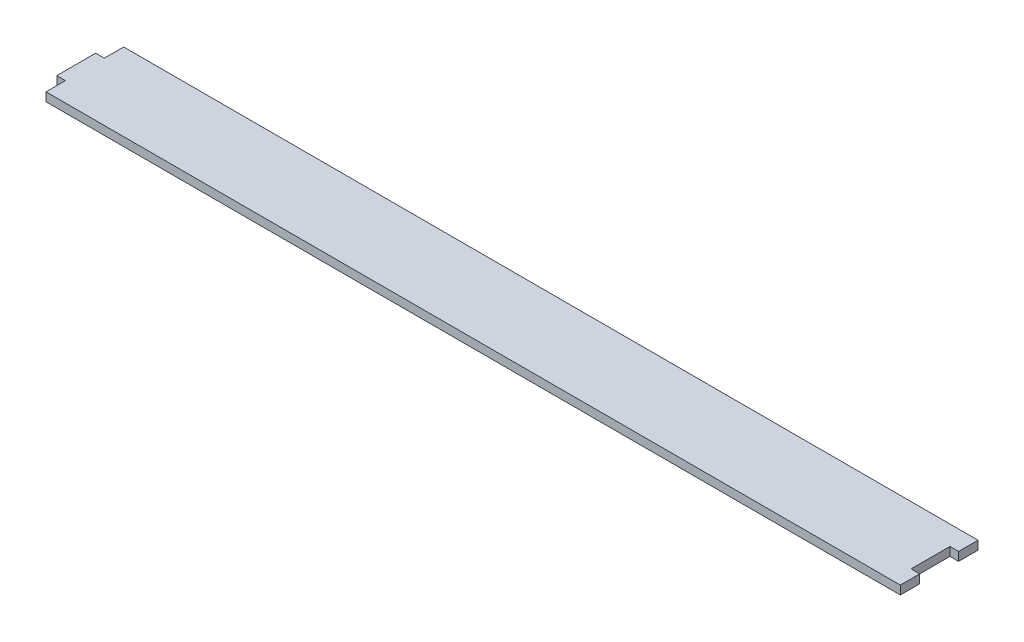
ISO-10303-21;
HEADER;
FILE_DESCRIPTION(('STEP AP214'),'2;1');
FILE_NAME('part.step','',(''),(''),'','','');
FILE_SCHEMA(('AUTOMOTIVE_DESIGN { 1 0 10303 214 1 1 1 1 }'));
ENDSEC;
DATA;
#1=APPLICATION_CONTEXT('core data for automotive mechanical design processes');
#2=APPLICATION_PROTOCOL_DEFINITION('international standard','automotive_design',2000,#1);
#3=PRODUCT_CONTEXT('',#1,'mechanical');
#4=PRODUCT('Part','Part','',(#3));
#5=PRODUCT_RELATED_PRODUCT_CATEGORY('part','',(#4));
#6=PRODUCT_DEFINITION_FORMATION('','',#4);
#7=PRODUCT_DEFINITION_CONTEXT('part definition',#1,'design');
#8=PRODUCT_DEFINITION('design','',#6,#7);
#9=PRODUCT_DEFINITION_SHAPE('','',#8);
#10=(LENGTH_UNIT() NAMED_UNIT(*) SI_UNIT(.MILLI.,.METRE.));
#11=(NAMED_UNIT(*) PLANE_ANGLE_UNIT() SI_UNIT($,.RADIAN.));
#12=(NAMED_UNIT(*) SI_UNIT($,.STERADIAN.) SOLID_ANGLE_UNIT());
#13=UNCERTAINTY_MEASURE_WITH_UNIT(LENGTH_MEASURE(1.E-05),#10,'distance_accuracy_value','');
#14=(GEOMETRIC_REPRESENTATION_CONTEXT(3) GLOBAL_UNCERTAINTY_ASSIGNED_CONTEXT((#13)) GLOBAL_UNIT_ASSIGNED_CONTEXT((#10,
#11,#12)) REPRESENTATION_CONTEXT('',''));
#15=CARTESIAN_POINT('',(0.,0.,0.));
#16=DIRECTION('',(0.,0.,1.));
#17=DIRECTION('',(1.,0.,0.));
#18=AXIS2_PLACEMENT_3D('',#15,#16,#17);
#19=CARTESIAN_POINT('',(3.99999999999999,4.,-27.));
#20=DIRECTION('',(-1.,0.,0.));
#21=DIRECTION('',(0.,0.,1.));
#22=AXIS2_PLACEMENT_3D('',#19,#20,#21);
#23=PLANE('',#22);
#24=DIRECTION('',(0.,0.,-1.));
#25=VECTOR('',#24,1.);
#26=CARTESIAN_POINT('',(3.99999999999999,0.,-27.));
#27=LINE('',#26,#25);
#28=CARTESIAN_POINT('',(3.99999999999999,0.,-27.));
#29=VERTEX_POINT('',#28);
#30=CARTESIAN_POINT('',(3.99999999999999,0.,-36.));
#31=VERTEX_POINT('',#30);
#32=EDGE_CURVE('E174',#29,#31,#27,.T.);
#33=ORIENTED_EDGE('',*,*,#32,.F.);
#34=DIRECTION('',(0.,-1.,0.));
#35=VECTOR('',#34,1.);
#36=CARTESIAN_POINT('',(3.99999999999999,4.,-27.));
#37=LINE('',#36,#35);
#38=CARTESIAN_POINT('',(3.99999999999999,4.,-27.));
#39=VERTEX_POINT('',#38);
#40=EDGE_CURVE('E11',#39,#29,#37,.T.);
#41=ORIENTED_EDGE('',*,*,#40,.F.);
#42=DIRECTION('',(0.,0.,-1.));
#43=VECTOR('',#42,1.);
#44=CARTESIAN_POINT('',(3.99999999999999,4.,-27.));
#45=LINE('',#44,#43);
#46=CARTESIAN_POINT('',(3.99999999999999,4.,-36.));
#47=VERTEX_POINT('',#46);
#48=EDGE_CURVE('E215',#39,#47,#45,.T.);
#49=ORIENTED_EDGE('',*,*,#48,.T.);
#50=DIRECTION('',(0.,-1.,0.));
#51=VECTOR('',#50,1.);
#52=CARTESIAN_POINT('',(3.99999999999999,4.,-36.));
#53=LINE('',#52,#51);
#54=EDGE_CURVE('E51',#47,#31,#53,.T.);
#55=ORIENTED_EDGE('',*,*,#54,.T.);
#56=EDGE_LOOP('',(#33,#41,#49,#55));
#57=FACE_BOUND('',#56,.T.);
#58=ADVANCED_FACE('F48',(#57),#23,.T.);
#59=CARTESIAN_POINT('',(0.,4.,-27.));
#60=DIRECTION('',(0.,0.,-1.));
#61=DIRECTION('',(-1.,0.,0.));
#62=AXIS2_PLACEMENT_3D('',#59,#60,#61);
#63=PLANE('',#62);
#64=DIRECTION('',(1.,0.,0.));
#65=VECTOR('',#64,1.);
#66=CARTESIAN_POINT('',(0.,0.,-27.));
#67=LINE('',#66,#65);
#68=CARTESIAN_POINT('',(0.,0.,-27.));
#69=VERTEX_POINT('',#68);
#70=EDGE_CURVE('E212',#69,#29,#67,.T.);
#71=ORIENTED_EDGE('',*,*,#70,.F.);
#72=DIRECTION('',(0.,-1.,0.));
#73=VECTOR('',#72,1.);
#74=CARTESIAN_POINT('',(0.,4.,-27.));
#75=LINE('',#74,#73);
#76=CARTESIAN_POINT('',(0.,4.,-27.));
#77=VERTEX_POINT('',#76);
#78=EDGE_CURVE('E58',#77,#69,#75,.T.);
#79=ORIENTED_EDGE('',*,*,#78,.F.);
#80=DIRECTION('',(1.,0.,0.));
#81=VECTOR('',#80,1.);
#82=CARTESIAN_POINT('',(0.,4.,-27.));
#83=LINE('',#82,#81);
#84=EDGE_CURVE('E149',#77,#39,#83,.T.);
#85=ORIENTED_EDGE('',*,*,#84,.T.);
#86=ORIENTED_EDGE('',*,*,#40,.T.);
#87=EDGE_LOOP('',(#71,#79,#85,#86));
#88=FACE_BOUND('',#87,.T.);
#89=ADVANCED_FACE('F249',(#88),#63,.T.);
#90=CARTESIAN_POINT('',(0.,4.,-27.));
#91=DIRECTION('',(1.,0.,0.));
#92=DIRECTION('',(0.,0.,-1.));
#93=AXIS2_PLACEMENT_3D('',#90,#91,#92);
#94=PLANE('',#93);
#95=DIRECTION('',(0.,0.,1.));
#96=VECTOR('',#95,1.);
#97=CARTESIAN_POINT('',(0.,0.,-27.));
#98=LINE('',#97,#96);
#99=CARTESIAN_POINT('',(0.,0.,-9.));
#100=VERTEX_POINT('',#99);
#101=EDGE_CURVE('E155',#69,#100,#98,.T.);
#102=ORIENTED_EDGE('',*,*,#101,.T.);
#103=DIRECTION('',(0.,-1.,0.));
#104=VECTOR('',#103,1.);
#105=CARTESIAN_POINT('',(0.,4.,-9.));
#106=LINE('',#105,#104);
#107=CARTESIAN_POINT('',(0.,4.,-9.));
#108=VERTEX_POINT('',#107);
#109=EDGE_CURVE('E153',#108,#100,#106,.T.);
#110=ORIENTED_EDGE('',*,*,#109,.F.);
#111=DIRECTION('',(0.,0.,1.));
#112=VECTOR('',#111,1.);
#113=CARTESIAN_POINT('',(0.,4.,-27.));
#114=LINE('',#113,#112);
#115=EDGE_CURVE('E143',#77,#108,#114,.T.);
#116=ORIENTED_EDGE('',*,*,#115,.F.);
#117=ORIENTED_EDGE('',*,*,#78,.T.);
#118=EDGE_LOOP('',(#102,#110,#116,#117));
#119=FACE_BOUND('',#118,.T.);
#120=ADVANCED_FACE('F154',(#119),#94,.F.);
#121=CARTESIAN_POINT('',(0.,4.,-9.));
#122=DIRECTION('',(0.,0.,-1.));
#123=DIRECTION('',(-1.,0.,0.));
#124=AXIS2_PLACEMENT_3D('',#121,#122,#123);
#125=PLANE('',#124);
#126=DIRECTION('',(1.,0.,0.));
#127=VECTOR('',#126,1.);
#128=CARTESIAN_POINT('',(0.,0.,-9.));
#129=LINE('',#128,#127);
#130=CARTESIAN_POINT('',(4.,0.,-9.));
#131=VERTEX_POINT('',#130);
#132=EDGE_CURVE('E207',#100,#131,#129,.T.);
#133=ORIENTED_EDGE('',*,*,#132,.T.);
#134=DIRECTION('',(0.,-1.,0.));
#135=VECTOR('',#134,1.);
#136=CARTESIAN_POINT('',(4.,4.,-9.));
#137=LINE('',#136,#135);
#138=CARTESIAN_POINT('',(4.,4.,-9.));
#139=VERTEX_POINT('',#138);
#140=EDGE_CURVE('E159',#139,#131,#137,.T.);
#141=ORIENTED_EDGE('',*,*,#140,.F.);
#142=DIRECTION('',(1.,0.,0.));
#143=VECTOR('',#142,1.);
#144=CARTESIAN_POINT('',(0.,4.,-9.));
#145=LINE('',#144,#143);
#146=EDGE_CURVE('E147',#108,#139,#145,.T.);
#147=ORIENTED_EDGE('',*,*,#146,.F.);
#148=ORIENTED_EDGE('',*,*,#109,.T.);
#149=EDGE_LOOP('',(#133,#141,#147,#148));
#150=FACE_BOUND('',#149,.T.);
#151=ADVANCED_FACE('F161',(#150),#125,.F.);
#152=CARTESIAN_POINT('',(4.,4.,-9.));
#153=DIRECTION('',(1.,0.,0.));
#154=DIRECTION('',(0.,0.,-1.));
#155=AXIS2_PLACEMENT_3D('',#152,#153,#154);
#156=PLANE('',#155);
#157=DIRECTION('',(0.,0.,1.));
#158=VECTOR('',#157,1.);
#159=CARTESIAN_POINT('',(4.,0.,-9.));
#160=LINE('',#159,#158);
#161=CARTESIAN_POINT('',(4.,0.,0.));
#162=VERTEX_POINT('',#161);
#163=EDGE_CURVE('E204',#131,#162,#160,.T.);
#164=ORIENTED_EDGE('',*,*,#163,.T.);
#165=DIRECTION('',(0.,-1.,0.));
#166=VECTOR('',#165,1.);
#167=CARTESIAN_POINT('',(4.,4.,0.));
#168=LINE('',#167,#166);
#169=CARTESIAN_POINT('',(4.,4.,0.));
#170=VERTEX_POINT('',#169);
#171=EDGE_CURVE('E221',#170,#162,#168,.T.);
#172=ORIENTED_EDGE('',*,*,#171,.F.);
#173=DIRECTION('',(0.,0.,1.));
#174=VECTOR('',#173,1.);
#175=CARTESIAN_POINT('',(4.,4.,-9.));
#176=LINE('',#175,#174);
#177=EDGE_CURVE('E165',#139,#170,#176,.T.);
#178=ORIENTED_EDGE('',*,*,#177,.F.);
#179=ORIENTED_EDGE('',*,*,#140,.T.);
#180=EDGE_LOOP('',(#164,#172,#178,#179));
#181=FACE_BOUND('',#180,.T.);
#182=ADVANCED_FACE('F262',(#181),#156,.F.);
#183=CARTESIAN_POINT('',(4.,4.,0.));
#184=DIRECTION('',(0.,0.,-1.));
#185=DIRECTION('',(-1.,0.,0.));
#186=AXIS2_PLACEMENT_3D('',#183,#184,#185);
#187=PLANE('',#186);
#188=DIRECTION('',(1.,0.,0.));
#189=VECTOR('',#188,1.);
#190=CARTESIAN_POINT('',(4.,0.,0.));
#191=LINE('',#190,#189);
#192=CARTESIAN_POINT('',(400.,0.,0.));
#193=VERTEX_POINT('',#192);
#194=EDGE_CURVE('E201',#162,#193,#191,.T.);
#195=ORIENTED_EDGE('',*,*,#194,.T.);
#196=DIRECTION('',(0.,-1.,0.));
#197=VECTOR('',#196,1.);
#198=CARTESIAN_POINT('',(400.,4.,0.));
#199=LINE('',#198,#197);
#200=CARTESIAN_POINT('',(400.,4.,0.));
#201=VERTEX_POINT('',#200);
#202=EDGE_CURVE('E225',#201,#193,#199,.T.);
#203=ORIENTED_EDGE('',*,*,#202,.F.);
#204=DIRECTION('',(1.,0.,0.));
#205=VECTOR('',#204,1.);
#206=CARTESIAN_POINT('',(4.,4.,0.));
#207=LINE('',#206,#205);
#208=EDGE_CURVE('E168',#170,#201,#207,.T.);
#209=ORIENTED_EDGE('',*,*,#208,.F.);
#210=ORIENTED_EDGE('',*,*,#171,.T.);
#211=EDGE_LOOP('',(#195,#203,#209,#210));
#212=FACE_BOUND('',#211,.T.);
#213=ADVANCED_FACE('F265',(#212),#187,.F.);
#214=CARTESIAN_POINT('',(400.,4.,0.));
#215=DIRECTION('',(-1.,0.,0.));
#216=DIRECTION('',(0.,0.,1.));
#217=AXIS2_PLACEMENT_3D('',#214,#215,#216);
#218=PLANE('',#217);
#219=DIRECTION('',(0.,0.,-1.));
#220=VECTOR('',#219,1.);
#221=CARTESIAN_POINT('',(400.,0.,0.));
#222=LINE('',#221,#220);
#223=CARTESIAN_POINT('',(400.,0.,-9.));
#224=VERTEX_POINT('',#223);
#225=EDGE_CURVE('E198',#193,#224,#222,.T.);
#226=ORIENTED_EDGE('',*,*,#225,.T.);
#227=DIRECTION('',(0.,-1.,0.));
#228=VECTOR('',#227,1.);
#229=CARTESIAN_POINT('',(400.,4.,-9.));
#230=LINE('',#229,#228);
#231=CARTESIAN_POINT('',(400.,4.,-9.));
#232=VERTEX_POINT('',#231);
#233=EDGE_CURVE('E229',#232,#224,#230,.T.);
#234=ORIENTED_EDGE('',*,*,#233,.F.);
#235=DIRECTION('',(0.,0.,-1.));
#236=VECTOR('',#235,1.);
#237=CARTESIAN_POINT('',(400.,4.,0.));
#238=LINE('',#237,#236);
#239=EDGE_CURVE('E446',#201,#232,#238,.T.);
#240=ORIENTED_EDGE('',*,*,#239,.F.);
#241=ORIENTED_EDGE('',*,*,#202,.T.);
#242=EDGE_LOOP('',(#226,#234,#240,#241));
#243=FACE_BOUND('',#242,.T.);
#244=ADVANCED_FACE('F269',(#243),#218,.F.);
#245=CARTESIAN_POINT('',(400.,4.,-9.));
#246=DIRECTION('',(0.,0.,1.));
#247=DIRECTION('',(1.,0.,0.));
#248=AXIS2_PLACEMENT_3D('',#245,#246,#247);
#249=PLANE('',#248);
#250=DIRECTION('',(-1.,0.,0.));
#251=VECTOR('',#250,1.);
#252=CARTESIAN_POINT('',(400.,0.,-9.));
#253=LINE('',#252,#251);
#254=CARTESIAN_POINT('',(396.,0.,-9.));
#255=VERTEX_POINT('',#254);
#256=EDGE_CURVE('E194',#224,#255,#253,.T.);
#257=ORIENTED_EDGE('',*,*,#256,.T.);
#258=DIRECTION('',(0.,-1.,0.));
#259=VECTOR('',#258,1.);
#260=CARTESIAN_POINT('',(396.,4.,-9.));
#261=LINE('',#260,#259);
#262=CARTESIAN_POINT('',(396.,4.,-9.));
#263=VERTEX_POINT('',#262);
#264=EDGE_CURVE('E233',#263,#255,#261,.T.);
#265=ORIENTED_EDGE('',*,*,#264,.F.);
#266=DIRECTION('',(-1.,0.,0.));
#267=VECTOR('',#266,1.);
#268=CARTESIAN_POINT('',(400.,4.,-9.));
#269=LINE('',#268,#267);
#270=EDGE_CURVE('E444',#232,#263,#269,.T.);
#271=ORIENTED_EDGE('',*,*,#270,.F.);
#272=ORIENTED_EDGE('',*,*,#233,.T.);
#273=EDGE_LOOP('',(#257,#265,#271,#272));
#274=FACE_BOUND('',#273,.T.);
#275=ADVANCED_FACE('F273',(#274),#249,.F.);
#276=CARTESIAN_POINT('',(396.,4.,-27.));
#277=DIRECTION('',(1.,0.,0.));
#278=DIRECTION('',(0.,0.,-1.));
#279=AXIS2_PLACEMENT_3D('',#276,#277,#278);
#280=PLANE('',#279);
#281=DIRECTION('',(0.,0.,1.));
#282=VECTOR('',#281,1.);
#283=CARTESIAN_POINT('',(396.,0.,-27.));
#284=LINE('',#283,#282);
#285=CARTESIAN_POINT('',(396.,0.,-27.));
#286=VERTEX_POINT('',#285);
#287=EDGE_CURVE('E190',#286,#255,#284,.T.);
#288=ORIENTED_EDGE('',*,*,#287,.F.);
#289=DIRECTION('',(0.,-1.,0.));
#290=VECTOR('',#289,1.);
#291=CARTESIAN_POINT('',(396.,4.,-27.));
#292=LINE('',#291,#290);
#293=CARTESIAN_POINT('',(396.,4.,-27.));
#294=VERTEX_POINT('',#293);
#295=EDGE_CURVE('E236',#294,#286,#292,.T.);
#296=ORIENTED_EDGE('',*,*,#295,.F.);
#297=DIRECTION('',(0.,0.,1.));
#298=VECTOR('',#297,1.);
#299=CARTESIAN_POINT('',(396.,4.,-27.));
#300=LINE('',#299,#298);
#301=EDGE_CURVE('E457',#294,#263,#300,.T.);
#302=ORIENTED_EDGE('',*,*,#301,.T.);
#303=ORIENTED_EDGE('',*,*,#264,.T.);
#304=EDGE_LOOP('',(#288,#296,#302,#303));
#305=FACE_BOUND('',#304,.T.);
#306=ADVANCED_FACE('F277',(#305),#280,.T.);
#307=CARTESIAN_POINT('',(400.,4.,-27.));
#308=DIRECTION('',(0.,0.,1.));
#309=DIRECTION('',(1.,0.,0.));
#310=AXIS2_PLACEMENT_3D('',#307,#308,#309);
#311=PLANE('',#310);
#312=DIRECTION('',(-1.,0.,0.));
#313=VECTOR('',#312,1.);
#314=CARTESIAN_POINT('',(400.,0.,-27.));
#315=LINE('',#314,#313);
#316=CARTESIAN_POINT('',(400.,0.,-27.));
#317=VERTEX_POINT('',#316);
#318=EDGE_CURVE('E186',#317,#286,#315,.T.);
#319=ORIENTED_EDGE('',*,*,#318,.F.);
#320=DIRECTION('',(0.,-1.,0.));
#321=VECTOR('',#320,1.);
#322=CARTESIAN_POINT('',(400.,4.,-27.));
#323=LINE('',#322,#321);
#324=CARTESIAN_POINT('',(400.,4.,-27.));
#325=VERTEX_POINT('',#324);
#326=EDGE_CURVE('E239',#325,#317,#323,.T.);
#327=ORIENTED_EDGE('',*,*,#326,.F.);
#328=DIRECTION('',(-1.,0.,0.));
#329=VECTOR('',#328,1.);
#330=CARTESIAN_POINT('',(400.,4.,-27.));
#331=LINE('',#330,#329);
#332=EDGE_CURVE('E435',#325,#294,#331,.T.);
#333=ORIENTED_EDGE('',*,*,#332,.T.);
#334=ORIENTED_EDGE('',*,*,#295,.T.);
#335=EDGE_LOOP('',(#319,#327,#333,#334));
#336=FACE_BOUND('',#335,.T.);
#337=ADVANCED_FACE('F281',(#336),#311,.T.);
#338=CARTESIAN_POINT('',(400.,4.,-27.));
#339=DIRECTION('',(-1.,0.,0.));
#340=DIRECTION('',(0.,0.,1.));
#341=AXIS2_PLACEMENT_3D('',#338,#339,#340);
#342=PLANE('',#341);
#343=DIRECTION('',(0.,0.,-1.));
#344=VECTOR('',#343,1.);
#345=CARTESIAN_POINT('',(400.,0.,-27.));
#346=LINE('',#345,#344);
#347=CARTESIAN_POINT('',(400.,0.,-36.));
#348=VERTEX_POINT('',#347);
#349=EDGE_CURVE('E182',#317,#348,#346,.T.);
#350=ORIENTED_EDGE('',*,*,#349,.T.);
#351=DIRECTION('',(0.,-1.,0.));
#352=VECTOR('',#351,1.);
#353=CARTESIAN_POINT('',(400.,4.,-36.));
#354=LINE('',#353,#352);
#355=CARTESIAN_POINT('',(400.,4.,-36.));
#356=VERTEX_POINT('',#355);
#357=EDGE_CURVE('E241',#356,#348,#354,.T.);
#358=ORIENTED_EDGE('',*,*,#357,.F.);
#359=DIRECTION('',(0.,0.,-1.));
#360=VECTOR('',#359,1.);
#361=CARTESIAN_POINT('',(400.,4.,-27.));
#362=LINE('',#361,#360);
#363=EDGE_CURVE('E462',#325,#356,#362,.T.);
#364=ORIENTED_EDGE('',*,*,#363,.F.);
#365=ORIENTED_EDGE('',*,*,#326,.T.);
#366=EDGE_LOOP('',(#350,#358,#364,#365));
#367=FACE_BOUND('',#366,.T.);
#368=ADVANCED_FACE('F285',(#367),#342,.F.);
#369=CARTESIAN_POINT('',(3.99999999999999,4.,-36.));
#370=DIRECTION('',(0.,0.,-1.));
#371=DIRECTION('',(-1.,0.,0.));
#372=AXIS2_PLACEMENT_3D('',#369,#370,#371);
#373=PLANE('',#372);
#374=DIRECTION('',(1.,0.,0.));
#375=VECTOR('',#374,1.);
#376=CARTESIAN_POINT('',(3.99999999999999,0.,-36.));
#377=LINE('',#376,#375);
#378=EDGE_CURVE('E178',#31,#348,#377,.T.);
#379=ORIENTED_EDGE('',*,*,#378,.F.);
#380=ORIENTED_EDGE('',*,*,#54,.F.);
#381=DIRECTION('',(1.,0.,0.));
#382=VECTOR('',#381,1.);
#383=CARTESIAN_POINT('',(3.99999999999999,4.,-36.));
#384=LINE('',#383,#382);
#385=EDGE_CURVE('E465',#47,#356,#384,.T.);
#386=ORIENTED_EDGE('',*,*,#385,.T.);
#387=ORIENTED_EDGE('',*,*,#357,.T.);
#388=EDGE_LOOP('',(#379,#380,#386,#387));
#389=FACE_BOUND('',#388,.T.);
#390=ADVANCED_FACE('F245',(#389),#373,.T.);
#391=CARTESIAN_POINT('',(0.,4.,0.));
#392=DIRECTION('',(0.,-1.,0.));
#393=DIRECTION('',(0.,0.,-1.));
#394=AXIS2_PLACEMENT_3D('',#391,#392,#393);
#395=PLANE('',#394);
#396=ORIENTED_EDGE('',*,*,#48,.F.);
#397=ORIENTED_EDGE('',*,*,#84,.F.);
#398=ORIENTED_EDGE('',*,*,#115,.T.);
#399=ORIENTED_EDGE('',*,*,#146,.T.);
#400=ORIENTED_EDGE('',*,*,#177,.T.);
#401=ORIENTED_EDGE('',*,*,#208,.T.);
#402=ORIENTED_EDGE('',*,*,#239,.T.);
#403=ORIENTED_EDGE('',*,*,#270,.T.);
#404=ORIENTED_EDGE('',*,*,#301,.F.);
#405=ORIENTED_EDGE('',*,*,#332,.F.);
#406=ORIENTED_EDGE('',*,*,#363,.T.);
#407=ORIENTED_EDGE('',*,*,#385,.F.);
#408=EDGE_LOOP('',(#396,#397,#398,#399,#400,#401,#402,#403,#404,#405,#406,#407));
#409=FACE_BOUND('',#408,.T.);
#410=ADVANCED_FACE('F145',(#409),#395,.F.);
#411=CARTESIAN_POINT('',(0.,0.,0.));
#412=DIRECTION('',(0.,-1.,0.));
#413=DIRECTION('',(0.,0.,-1.));
#414=AXIS2_PLACEMENT_3D('',#411,#412,#413);
#415=PLANE('',#414);
#416=ORIENTED_EDGE('',*,*,#32,.T.);
#417=ORIENTED_EDGE('',*,*,#378,.T.);
#418=ORIENTED_EDGE('',*,*,#349,.F.);
#419=ORIENTED_EDGE('',*,*,#318,.T.);
#420=ORIENTED_EDGE('',*,*,#287,.T.);
#421=ORIENTED_EDGE('',*,*,#256,.F.);
#422=ORIENTED_EDGE('',*,*,#225,.F.);
#423=ORIENTED_EDGE('',*,*,#194,.F.);
#424=ORIENTED_EDGE('',*,*,#163,.F.);
#425=ORIENTED_EDGE('',*,*,#132,.F.);
#426=ORIENTED_EDGE('',*,*,#101,.F.);
#427=ORIENTED_EDGE('',*,*,#70,.T.);
#428=EDGE_LOOP('',(#416,#417,#418,#419,#420,#421,#422,#423,#424,#425,#426,#427));
#429=FACE_BOUND('',#428,.T.);
#430=ADVANCED_FACE('F248',(#429),#415,.T.);
#431=CLOSED_SHELL('',(#58,#89,#120,#151,#182,#213,#244,#275,#306,#337,#368,#390,#410,#430));
#432=MANIFOLD_SOLID_BREP('B2',#431);
#433=ADVANCED_BREP_SHAPE_REPRESENTATION('',(#18,#432),#14);
#434=SHAPE_DEFINITION_REPRESENTATION(#9,#433);
ENDSEC;
END-ISO-10303-21;
